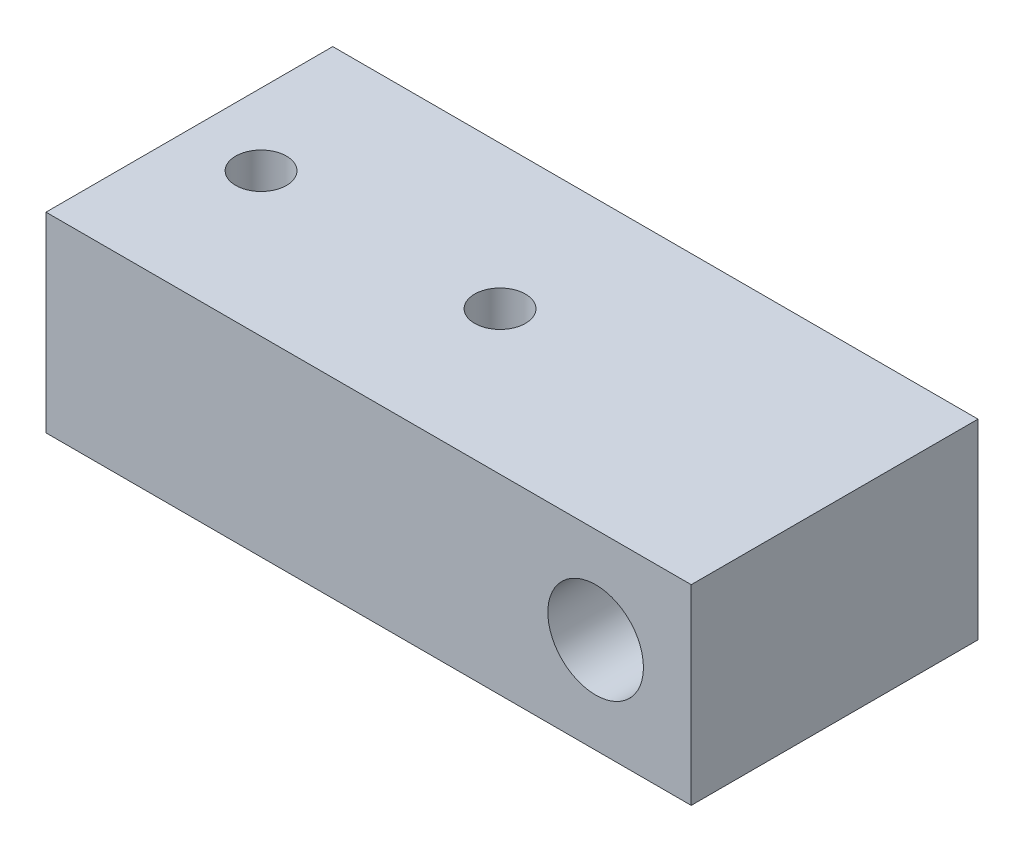
ISO-10303-21;
HEADER;
FILE_DESCRIPTION(('STEP AP214'),'2;1');
FILE_NAME('part.step','',(''),(''),'','','');
FILE_SCHEMA(('AUTOMOTIVE_DESIGN { 1 0 10303 214 1 1 1 1 }'));
ENDSEC;
DATA;
#1=APPLICATION_CONTEXT('core data for automotive mechanical design processes');
#2=APPLICATION_PROTOCOL_DEFINITION('international standard','automotive_design',2000,#1);
#3=PRODUCT_CONTEXT('',#1,'mechanical');
#4=PRODUCT('Part','Part','',(#3));
#5=PRODUCT_RELATED_PRODUCT_CATEGORY('part','',(#4));
#6=PRODUCT_DEFINITION_FORMATION('','',#4);
#7=PRODUCT_DEFINITION_CONTEXT('part definition',#1,'design');
#8=PRODUCT_DEFINITION('design','',#6,#7);
#9=PRODUCT_DEFINITION_SHAPE('','',#8);
#10=(LENGTH_UNIT() NAMED_UNIT(*) SI_UNIT(.MILLI.,.METRE.));
#11=(NAMED_UNIT(*) PLANE_ANGLE_UNIT() SI_UNIT($,.RADIAN.));
#12=(NAMED_UNIT(*) SI_UNIT($,.STERADIAN.) SOLID_ANGLE_UNIT());
#13=UNCERTAINTY_MEASURE_WITH_UNIT(LENGTH_MEASURE(1.E-05),#10,'distance_accuracy_value','');
#14=(GEOMETRIC_REPRESENTATION_CONTEXT(3) GLOBAL_UNCERTAINTY_ASSIGNED_CONTEXT((#13)) GLOBAL_UNIT_ASSIGNED_CONTEXT((#10,
#11,#12)) REPRESENTATION_CONTEXT('',''));
#15=CARTESIAN_POINT('',(0.,0.,0.));
#16=DIRECTION('',(0.,0.,1.));
#17=DIRECTION('',(1.,0.,0.));
#18=AXIS2_PLACEMENT_3D('',#15,#16,#17);
#19=CARTESIAN_POINT('',(42.8625,12.7,-19.05));
#20=DIRECTION('',(-1.,0.,0.));
#21=DIRECTION('',(0.,0.,1.));
#22=AXIS2_PLACEMENT_3D('',#19,#20,#21);
#23=PLANE('',#22);
#24=DIRECTION('',(0.,0.,-1.));
#25=VECTOR('',#24,1.);
#26=CARTESIAN_POINT('',(42.8625,-12.7,-19.05));
#27=LINE('',#26,#25);
#28=CARTESIAN_POINT('',(42.8625,-12.7,19.05));
#29=VERTEX_POINT('',#28);
#30=CARTESIAN_POINT('',(42.8625,-12.7,-19.05));
#31=VERTEX_POINT('',#30);
#32=EDGE_CURVE('E107',#29,#31,#27,.T.);
#33=ORIENTED_EDGE('',*,*,#32,.T.);
#34=DIRECTION('',(0.,-1.,0.));
#35=VECTOR('',#34,1.);
#36=CARTESIAN_POINT('',(42.8625,12.7,-19.05));
#37=LINE('',#36,#35);
#38=CARTESIAN_POINT('',(42.8625,12.7,-19.05));
#39=VERTEX_POINT('',#38);
#40=EDGE_CURVE('E11',#39,#31,#37,.T.);
#41=ORIENTED_EDGE('',*,*,#40,.F.);
#42=DIRECTION('',(0.,0.,-1.));
#43=VECTOR('',#42,1.);
#44=CARTESIAN_POINT('',(42.8625,12.7,-19.05));
#45=LINE('',#44,#43);
#46=CARTESIAN_POINT('',(42.8625,12.7,19.05));
#47=VERTEX_POINT('',#46);
#48=EDGE_CURVE('E90',#47,#39,#45,.T.);
#49=ORIENTED_EDGE('',*,*,#48,.F.);
#50=DIRECTION('',(0.,-1.,0.));
#51=VECTOR('',#50,1.);
#52=CARTESIAN_POINT('',(42.8625,12.7,19.05));
#53=LINE('',#52,#51);
#54=EDGE_CURVE('E103',#47,#29,#53,.T.);
#55=ORIENTED_EDGE('',*,*,#54,.T.);
#56=EDGE_LOOP('',(#33,#41,#49,#55));
#57=FACE_BOUND('',#56,.T.);
#58=ADVANCED_FACE('F38',(#57),#23,.F.);
#59=CARTESIAN_POINT('',(-42.8625,12.7,-19.05));
#60=DIRECTION('',(0.,0.,1.));
#61=DIRECTION('',(1.,0.,0.));
#62=AXIS2_PLACEMENT_3D('',#59,#60,#61);
#63=PLANE('',#62);
#64=CARTESIAN_POINT('',(30.1625,0.,-19.05));
#65=DIRECTION('',(0.,0.,1.));
#66=DIRECTION('',(1.,0.,0.));
#67=AXIS2_PLACEMENT_3D('',#64,#65,#66);
#68=CIRCLE('',#67,6.34999999999999);
#69=CARTESIAN_POINT('',(36.5125,0.,-19.05));
#70=VERTEX_POINT('',#69);
#71=EDGE_CURVE('E111',#70,#70,#68,.T.);
#72=ORIENTED_EDGE('',*,*,#71,.T.);
#73=EDGE_LOOP('',(#72));
#74=FACE_BOUND('',#73,.T.);
#75=DIRECTION('',(-1.,0.,0.));
#76=VECTOR('',#75,1.);
#77=CARTESIAN_POINT('',(-42.8625,-12.7,-19.05));
#78=LINE('',#77,#76);
#79=CARTESIAN_POINT('',(-42.8625,-12.7,-19.05));
#80=VERTEX_POINT('',#79);
#81=EDGE_CURVE('E95',#31,#80,#78,.T.);
#82=ORIENTED_EDGE('',*,*,#81,.T.);
#83=DIRECTION('',(0.,-1.,0.));
#84=VECTOR('',#83,1.);
#85=CARTESIAN_POINT('',(-42.8625,12.7,-19.05));
#86=LINE('',#85,#84);
#87=CARTESIAN_POINT('',(-42.8625,12.7,-19.05));
#88=VERTEX_POINT('',#87);
#89=EDGE_CURVE('E47',#88,#80,#86,.T.);
#90=ORIENTED_EDGE('',*,*,#89,.F.);
#91=DIRECTION('',(-1.,0.,0.));
#92=VECTOR('',#91,1.);
#93=CARTESIAN_POINT('',(-42.8625,12.7,-19.05));
#94=LINE('',#93,#92);
#95=EDGE_CURVE('E85',#39,#88,#94,.T.);
#96=ORIENTED_EDGE('',*,*,#95,.F.);
#97=ORIENTED_EDGE('',*,*,#40,.T.);
#98=EDGE_LOOP('',(#82,#90,#96,#97));
#99=FACE_BOUND('',#98,.T.);
#100=ADVANCED_FACE('F94',(#74,#99),#63,.F.);
#101=CARTESIAN_POINT('',(-42.8625,12.7,-19.05));
#102=DIRECTION('',(1.,0.,0.));
#103=DIRECTION('',(0.,0.,-1.));
#104=AXIS2_PLACEMENT_3D('',#101,#102,#103);
#105=PLANE('',#104);
#106=DIRECTION('',(0.,0.,1.));
#107=VECTOR('',#106,1.);
#108=CARTESIAN_POINT('',(-42.8625,-12.7,-19.05));
#109=LINE('',#108,#107);
#110=CARTESIAN_POINT('',(-42.8625,-12.7,19.05));
#111=VERTEX_POINT('',#110);
#112=EDGE_CURVE('E72',#80,#111,#109,.T.);
#113=ORIENTED_EDGE('',*,*,#112,.T.);
#114=DIRECTION('',(0.,-1.,0.));
#115=VECTOR('',#114,1.);
#116=CARTESIAN_POINT('',(-42.8625,12.7,19.05));
#117=LINE('',#116,#115);
#118=CARTESIAN_POINT('',(-42.8625,12.7,19.05));
#119=VERTEX_POINT('',#118);
#120=EDGE_CURVE('E97',#119,#111,#117,.T.);
#121=ORIENTED_EDGE('',*,*,#120,.F.);
#122=DIRECTION('',(0.,0.,1.));
#123=VECTOR('',#122,1.);
#124=CARTESIAN_POINT('',(-42.8625,12.7,-19.05));
#125=LINE('',#124,#123);
#126=EDGE_CURVE('E88',#88,#119,#125,.T.);
#127=ORIENTED_EDGE('',*,*,#126,.F.);
#128=ORIENTED_EDGE('',*,*,#89,.T.);
#129=EDGE_LOOP('',(#113,#121,#127,#128));
#130=FACE_BOUND('',#129,.T.);
#131=ADVANCED_FACE('F98',(#130),#105,.F.);
#132=CARTESIAN_POINT('',(-42.8625,12.7,19.05));
#133=DIRECTION('',(0.,0.,-1.));
#134=DIRECTION('',(-1.,0.,0.));
#135=AXIS2_PLACEMENT_3D('',#132,#133,#134);
#136=PLANE('',#135);
#137=CARTESIAN_POINT('',(30.1625,0.,19.05));
#138=DIRECTION('',(0.,0.,1.));
#139=DIRECTION('',(1.,0.,0.));
#140=AXIS2_PLACEMENT_3D('',#137,#138,#139);
#141=CIRCLE('',#140,6.35);
#142=CARTESIAN_POINT('',(36.5125,0.,19.05));
#143=VERTEX_POINT('',#142);
#144=EDGE_CURVE('E133',#143,#143,#141,.T.);
#145=ORIENTED_EDGE('',*,*,#144,.F.);
#146=EDGE_LOOP('',(#145));
#147=FACE_BOUND('',#146,.T.);
#148=DIRECTION('',(1.,0.,0.));
#149=VECTOR('',#148,1.);
#150=CARTESIAN_POINT('',(-42.8625,-12.7,19.05));
#151=LINE('',#150,#149);
#152=EDGE_CURVE('E78',#111,#29,#151,.T.);
#153=ORIENTED_EDGE('',*,*,#152,.T.);
#154=ORIENTED_EDGE('',*,*,#54,.F.);
#155=DIRECTION('',(1.,0.,0.));
#156=VECTOR('',#155,1.);
#157=CARTESIAN_POINT('',(-42.8625,12.7,19.05));
#158=LINE('',#157,#156);
#159=EDGE_CURVE('E55',#119,#47,#158,.T.);
#160=ORIENTED_EDGE('',*,*,#159,.F.);
#161=ORIENTED_EDGE('',*,*,#120,.T.);
#162=EDGE_LOOP('',(#153,#154,#160,#161));
#163=FACE_BOUND('',#162,.T.);
#164=ADVANCED_FACE('F122',(#147,#163),#136,.F.);
#165=CARTESIAN_POINT('',(0.,12.7,0.));
#166=DIRECTION('',(0.,1.,0.));
#167=DIRECTION('',(0.,0.,1.));
#168=AXIS2_PLACEMENT_3D('',#165,#166,#167);
#169=PLANE('',#168);
#170=CARTESIAN_POINT('',(-33.3375,12.7,0.));
#171=DIRECTION('',(0.,1.,0.));
#172=DIRECTION('',(0.,0.,1.));
#173=AXIS2_PLACEMENT_3D('',#170,#171,#172);
#174=CIRCLE('',#173,3.3782);
#175=CARTESIAN_POINT('',(-33.3375,12.7,3.3782));
#176=VERTEX_POINT('',#175);
#177=EDGE_CURVE('E149',#176,#176,#174,.T.);
#178=ORIENTED_EDGE('',*,*,#177,.F.);
#179=EDGE_LOOP('',(#178));
#180=FACE_BOUND('',#179,.T.);
#181=CARTESIAN_POINT('',(-1.5875,12.7,0.));
#182=DIRECTION('',(0.,1.,0.));
#183=DIRECTION('',(0.,0.,1.));
#184=AXIS2_PLACEMENT_3D('',#181,#182,#183);
#185=CIRCLE('',#184,3.3782);
#186=CARTESIAN_POINT('',(-1.5875,12.7,3.3782));
#187=VERTEX_POINT('',#186);
#188=EDGE_CURVE('E141',#187,#187,#185,.T.);
#189=ORIENTED_EDGE('',*,*,#188,.F.);
#190=EDGE_LOOP('',(#189));
#191=FACE_BOUND('',#190,.T.);
#192=ORIENTED_EDGE('',*,*,#48,.T.);
#193=ORIENTED_EDGE('',*,*,#95,.T.);
#194=ORIENTED_EDGE('',*,*,#126,.T.);
#195=ORIENTED_EDGE('',*,*,#159,.T.);
#196=EDGE_LOOP('',(#192,#193,#194,#195));
#197=FACE_BOUND('',#196,.T.);
#198=ADVANCED_FACE('F86',(#180,#191,#197),#169,.T.);
#199=CARTESIAN_POINT('',(0.,-12.7,0.));
#200=DIRECTION('',(0.,1.,0.));
#201=DIRECTION('',(0.,0.,1.));
#202=AXIS2_PLACEMENT_3D('',#199,#200,#201);
#203=PLANE('',#202);
#204=CARTESIAN_POINT('',(-33.3375,-12.7,0.));
#205=DIRECTION('',(0.,1.,0.));
#206=DIRECTION('',(0.,0.,1.));
#207=AXIS2_PLACEMENT_3D('',#204,#205,#206);
#208=CIRCLE('',#207,3.37819999999999);
#209=CARTESIAN_POINT('',(-33.3375,-12.7,3.37819999999999));
#210=VERTEX_POINT('',#209);
#211=EDGE_CURVE('E145',#210,#210,#208,.T.);
#212=ORIENTED_EDGE('',*,*,#211,.T.);
#213=EDGE_LOOP('',(#212));
#214=FACE_BOUND('',#213,.T.);
#215=CARTESIAN_POINT('',(-1.5875,-12.7,0.));
#216=DIRECTION('',(0.,1.,0.));
#217=DIRECTION('',(0.,0.,1.));
#218=AXIS2_PLACEMENT_3D('',#215,#216,#217);
#219=CIRCLE('',#218,3.37819999999999);
#220=CARTESIAN_POINT('',(-1.5875,-12.7,3.37819999999999));
#221=VERTEX_POINT('',#220);
#222=EDGE_CURVE('E137',#221,#221,#219,.T.);
#223=ORIENTED_EDGE('',*,*,#222,.T.);
#224=EDGE_LOOP('',(#223));
#225=FACE_BOUND('',#224,.T.);
#226=ORIENTED_EDGE('',*,*,#32,.F.);
#227=ORIENTED_EDGE('',*,*,#152,.F.);
#228=ORIENTED_EDGE('',*,*,#112,.F.);
#229=ORIENTED_EDGE('',*,*,#81,.F.);
#230=EDGE_LOOP('',(#226,#227,#228,#229));
#231=FACE_BOUND('',#230,.T.);
#232=ADVANCED_FACE('F125',(#214,#225,#231),#203,.F.);
#233=CARTESIAN_POINT('',(30.1625,0.,19.05));
#234=DIRECTION('',(0.,0.,1.));
#235=DIRECTION('',(1.,0.,0.));
#236=AXIS2_PLACEMENT_3D('',#233,#234,#235);
#237=CYLINDRICAL_SURFACE('',#236,6.34999999999999);
#238=ORIENTED_EDGE('',*,*,#71,.F.);
#239=EDGE_LOOP('',(#238));
#240=FACE_BOUND('',#239,.T.);
#241=ORIENTED_EDGE('',*,*,#144,.T.);
#242=EDGE_LOOP('',(#241));
#243=FACE_BOUND('',#242,.T.);
#244=ADVANCED_FACE('F164',(#240,#243),#237,.F.);
#245=CARTESIAN_POINT('',(-1.5875,12.7,0.));
#246=DIRECTION('',(0.,1.,0.));
#247=DIRECTION('',(0.,0.,1.));
#248=AXIS2_PLACEMENT_3D('',#245,#246,#247);
#249=CYLINDRICAL_SURFACE('',#248,3.3782);
#250=ORIENTED_EDGE('',*,*,#222,.F.);
#251=EDGE_LOOP('',(#250));
#252=FACE_BOUND('',#251,.T.);
#253=ORIENTED_EDGE('',*,*,#188,.T.);
#254=EDGE_LOOP('',(#253));
#255=FACE_BOUND('',#254,.T.);
#256=ADVANCED_FACE('F162',(#252,#255),#249,.F.);
#257=CARTESIAN_POINT('',(-33.3375,12.7,0.));
#258=DIRECTION('',(0.,1.,0.));
#259=DIRECTION('',(0.,0.,1.));
#260=AXIS2_PLACEMENT_3D('',#257,#258,#259);
#261=CYLINDRICAL_SURFACE('',#260,3.3782);
#262=ORIENTED_EDGE('',*,*,#211,.F.);
#263=EDGE_LOOP('',(#262));
#264=FACE_BOUND('',#263,.T.);
#265=ORIENTED_EDGE('',*,*,#177,.T.);
#266=EDGE_LOOP('',(#265));
#267=FACE_BOUND('',#266,.T.);
#268=ADVANCED_FACE('F155',(#264,#267),#261,.F.);
#269=CLOSED_SHELL('',(#58,#100,#131,#164,#198,#232,#244,#256,#268));
#270=MANIFOLD_SOLID_BREP('B2',#269);
#271=ADVANCED_BREP_SHAPE_REPRESENTATION('',(#18,#270),#14);
#272=SHAPE_DEFINITION_REPRESENTATION(#9,#271);
ENDSEC;
END-ISO-10303-21;
